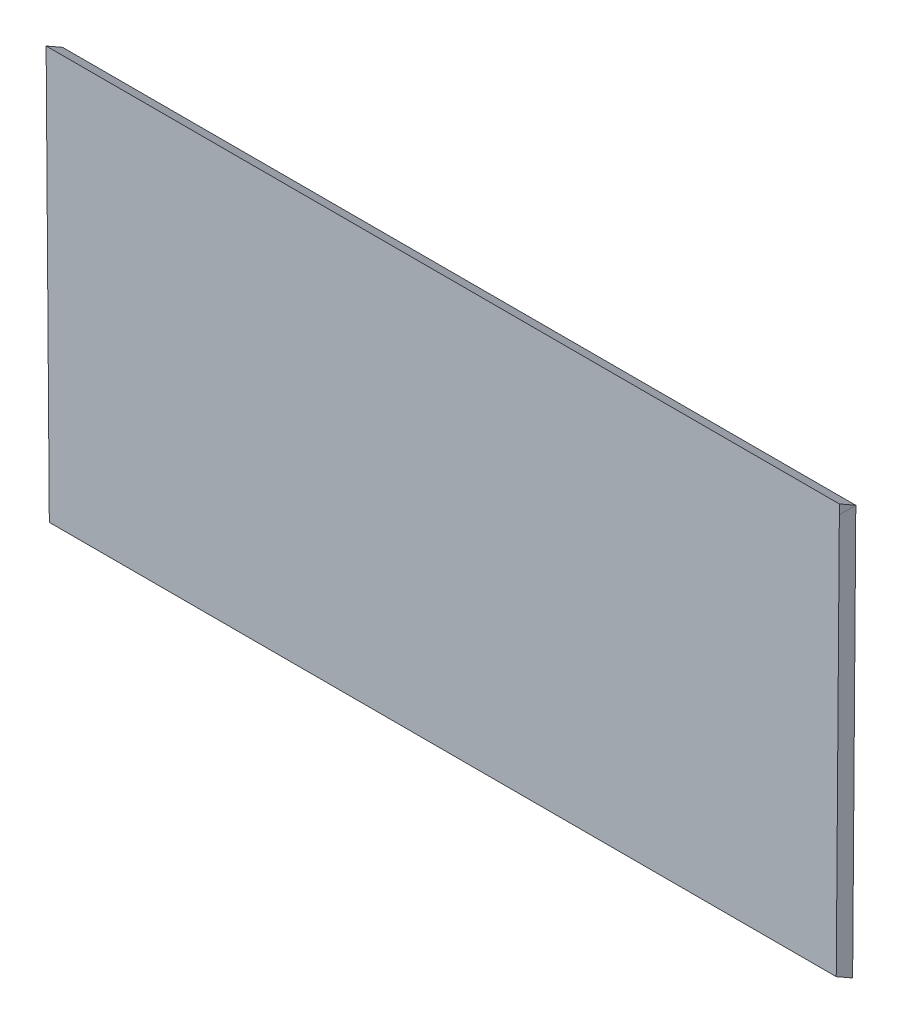
ISO-10303-21;
HEADER;
FILE_DESCRIPTION(('STEP AP214'),'2;1');
FILE_NAME('part.step','',(''),(''),'','','');
FILE_SCHEMA(('AUTOMOTIVE_DESIGN { 1 0 10303 214 1 1 1 1 }'));
ENDSEC;
DATA;
#1=APPLICATION_CONTEXT('core data for automotive mechanical design processes');
#2=APPLICATION_PROTOCOL_DEFINITION('international standard','automotive_design',2000,#1);
#3=PRODUCT_CONTEXT('',#1,'mechanical');
#4=PRODUCT('Part','Part','',(#3));
#5=PRODUCT_RELATED_PRODUCT_CATEGORY('part','',(#4));
#6=PRODUCT_DEFINITION_FORMATION('','',#4);
#7=PRODUCT_DEFINITION_CONTEXT('part definition',#1,'design');
#8=PRODUCT_DEFINITION('design','',#6,#7);
#9=PRODUCT_DEFINITION_SHAPE('','',#8);
#10=(LENGTH_UNIT() NAMED_UNIT(*) SI_UNIT(.MILLI.,.METRE.));
#11=(NAMED_UNIT(*) PLANE_ANGLE_UNIT() SI_UNIT($,.RADIAN.));
#12=(NAMED_UNIT(*) SI_UNIT($,.STERADIAN.) SOLID_ANGLE_UNIT());
#13=UNCERTAINTY_MEASURE_WITH_UNIT(LENGTH_MEASURE(1.E-05),#10,'distance_accuracy_value','');
#14=(GEOMETRIC_REPRESENTATION_CONTEXT(3) GLOBAL_UNCERTAINTY_ASSIGNED_CONTEXT((#13)) GLOBAL_UNIT_ASSIGNED_CONTEXT((#10,
#11,#12)) REPRESENTATION_CONTEXT('',''));
#15=CARTESIAN_POINT('',(0.,0.,0.));
#16=DIRECTION('',(0.,0.,1.));
#17=DIRECTION('',(1.,0.,0.));
#18=AXIS2_PLACEMENT_3D('',#15,#16,#17);
#19=CARTESIAN_POINT('',(-627.102450024694,177.628398295267,30.));
#20=DIRECTION('',(0.999969839219337,0.00776663708782409,0.));
#21=DIRECTION('',(-0.00776663708782409,0.999969839219337,0.));
#22=AXIS2_PLACEMENT_3D('',#19,#20,#21);
#23=PLANE('',#22);
#24=DIRECTION('',(0.00385284417816157,-0.496061284930305,-0.868278962767746));
#25=VECTOR('',#24,1.);
#26=CARTESIAN_POINT('',(-622.819156151908,-373.854133573587,345.089559888972));
#27=LINE('',#26,#25);
#28=CARTESIAN_POINT('',(-621.4209983841,-553.869703049566,30.));
#29=VERTEX_POINT('',#28);
#30=CARTESIAN_POINT('',(-621.287879502524,-571.009021534682,0.000259788680210009));
#31=VERTEX_POINT('',#30);
#32=EDGE_CURVE('E259',#29,#31,#27,.T.);
#33=ORIENTED_EDGE('',*,*,#32,.F.);
#34=DIRECTION('',(0.00776663708782409,-0.999969839219337,0.));
#35=VECTOR('',#34,1.);
#36=CARTESIAN_POINT('',(-627.102450024694,177.628398295267,30.));
#37=LINE('',#36,#35);
#38=CARTESIAN_POINT('',(-627.101225012347,177.628398295267,30.));
#39=VERTEX_POINT('',#38);
#40=EDGE_CURVE('E105',#39,#29,#37,.T.);
#41=ORIENTED_EDGE('',*,*,#40,.F.);
#42=CARTESIAN_POINT('',(-627.102450024694,177.628398295267,30.));
#43=DIRECTION('',(0.,0.,-1.));
#44=VECTOR('',#43,1.);
#45=LINE('',#42,#44);
#46=CARTESIAN_POINT('',(-627.101225012347,177.628398295267,0.));
#47=VERTEX_POINT('',#46);
#48=EDGE_CURVE('E11',#39,#47,#45,.T.);
#49=ORIENTED_EDGE('',*,*,#48,.T.);
#50=DIRECTION('',(0.00776663708782409,-0.999969839219337,0.));
#51=VECTOR('',#50,1.);
#52=CARTESIAN_POINT('',(-627.102450024694,177.628398295267,0.));
#53=LINE('',#52,#51);
#54=CARTESIAN_POINT('',(-621.287879502524,-571.009021534682,0.));
#55=VERTEX_POINT('',#54);
#56=EDGE_CURVE('E89',#47,#55,#53,.T.);
#57=ORIENTED_EDGE('',*,*,#56,.T.);
#58=DIRECTION('',(0.,0.,-1.));
#59=VECTOR('',#58,1.);
#60=CARTESIAN_POINT('',(-621.287879502524,-571.009021534682,30.));
#61=LINE('',#60,#59);
#62=EDGE_CURVE('E47',#31,#55,#61,.T.);
#63=ORIENTED_EDGE('',*,*,#62,.F.);
#64=EDGE_LOOP('',(#33,#41,#49,#57,#63));
#65=FACE_BOUND('',#64,.T.);
#66=ADVANCED_FACE('F39',(#65),#23,.F.);
#67=CARTESIAN_POINT('',(-621.287879502524,-571.009021534682,30.));
#68=DIRECTION('',(1.03560111525525E-07,0.999999999999995,0.));
#69=DIRECTION('',(-0.999999999999995,1.03560111525525E-07,0.));
#70=AXIS2_PLACEMENT_3D('',#67,#68,#69);
#71=PLANE('',#70);
#72=DIRECTION('',(0.999999999999978,-1.03560111525524E-07,-1.81266043029597E-07));
#73=VECTOR('',#72,1.);
#74=CARTESIAN_POINT('',(-621.287884940458,-571.009021534681,0.000259788681195722));
#75=LINE('',#74,#73);
#76=CARTESIAN_POINT('',(811.902120497476,-571.009169955998,0.));
#77=VERTEX_POINT('',#76);
#78=EDGE_CURVE('E83',#31,#77,#75,.T.);
#79=ORIENTED_EDGE('',*,*,#78,.F.);
#80=ORIENTED_EDGE('',*,*,#62,.T.);
#81=DIRECTION('',(0.999999999999994,-1.03560111525525E-07,0.));
#82=VECTOR('',#81,1.);
#83=CARTESIAN_POINT('',(-621.287879502524,-571.009021534682,0.));
#84=LINE('',#83,#82);
#85=EDGE_CURVE('E85',#55,#77,#84,.T.);
#86=ORIENTED_EDGE('',*,*,#85,.T.);
#87=EDGE_LOOP('',(#79,#80,#86));
#88=FACE_BOUND('',#87,.T.);
#89=ADVANCED_FACE('F78',(#88),#71,.F.);
#90=CARTESIAN_POINT('',(811.902120497476,-571.009169955998,30.));
#91=DIRECTION('',(-0.999970037468631,0.00774107001553363,0.));
#92=DIRECTION('',(-0.00774107001553363,-0.999970037468631,0.));
#93=AXIS2_PLACEMENT_3D('',#90,#91,#92);
#94=PLANE('',#93);
#95=DIRECTION('',(0.00384016038691892,0.496061309132617,0.86827900513017));
#96=VECTOR('',#95,1.);
#97=CARTESIAN_POINT('',(812.002150416685,-558.087581356681,22.6172529224951));
#98=LINE('',#97,#96);
#99=CARTESIAN_POINT('',(812.03480228631,-553.869703049566,30.));
#100=VERTEX_POINT('',#99);
#101=EDGE_CURVE('E57',#77,#100,#98,.T.);
#102=ORIENTED_EDGE('',*,*,#101,.F.);
#103=DIRECTION('',(0.00774107001553363,0.999970037468631,0.));
#104=VECTOR('',#103,1.);
#105=CARTESIAN_POINT('',(811.902120497476,-571.009169955998,0.));
#106=LINE('',#105,#104);
#107=CARTESIAN_POINT('',(817.698774987653,177.628398295267,0.));
#108=VERTEX_POINT('',#107);
#109=EDGE_CURVE('E99',#77,#108,#106,.T.);
#110=ORIENTED_EDGE('',*,*,#109,.T.);
#111=CARTESIAN_POINT('',(817.7,177.628398295267,30.));
#112=DIRECTION('',(0.,0.,-1.));
#113=VECTOR('',#112,1.);
#114=LINE('',#111,#113);
#115=CARTESIAN_POINT('',(817.698774987653,177.628398295267,30.));
#116=VERTEX_POINT('',#115);
#117=EDGE_CURVE('E86',#116,#108,#114,.T.);
#118=ORIENTED_EDGE('',*,*,#117,.F.);
#119=DIRECTION('',(0.00774107001553363,0.999970037468631,0.));
#120=VECTOR('',#119,1.);
#121=CARTESIAN_POINT('',(811.902120497476,-571.009169955998,30.));
#122=LINE('',#121,#120);
#123=EDGE_CURVE('E43',#100,#116,#122,.T.);
#124=ORIENTED_EDGE('',*,*,#123,.F.);
#125=EDGE_LOOP('',(#102,#110,#118,#124));
#126=FACE_BOUND('',#125,.T.);
#127=ADVANCED_FACE('F133',(#126),#94,.F.);
#128=CARTESIAN_POINT('',(0.,0.,30.));
#129=DIRECTION('',(0.,0.,-1.));
#130=DIRECTION('',(-1.,0.,0.));
#131=AXIS2_PLACEMENT_3D('',#128,#129,#130);
#132=PLANE('',#131);
#133=DIRECTION('',(-1.,0.,0.));
#134=VECTOR('',#133,1.);
#135=CARTESIAN_POINT('',(817.7,-553.869703049566,30.));
#136=LINE('',#135,#134);
#137=EDGE_CURVE('E274',#100,#29,#136,.T.);
#138=ORIENTED_EDGE('',*,*,#137,.F.);
#139=ORIENTED_EDGE('',*,*,#123,.T.);
#140=DIRECTION('',(0.,-1.,0.));
#141=VECTOR('',#140,1.);
#142=CARTESIAN_POINT('',(817.7,177.628398295267,30.));
#143=LINE('',#142,#141);
#144=CARTESIAN_POINT('',(817.7,194.767865201699,30.));
#145=VERTEX_POINT('',#144);
#146=EDGE_CURVE('E244',#145,#116,#143,.T.);
#147=ORIENTED_EDGE('',*,*,#146,.F.);
#148=DIRECTION('',(1.,0.,0.));
#149=VECTOR('',#148,1.);
#150=CARTESIAN_POINT('',(-627.1,194.767865201699,30.));
#151=LINE('',#150,#149);
#152=CARTESIAN_POINT('',(-627.1,194.767865201699,30.));
#153=VERTEX_POINT('',#152);
#154=EDGE_CURVE('E124',#153,#145,#151,.T.);
#155=ORIENTED_EDGE('',*,*,#154,.F.);
#156=DIRECTION('',(0.,-1.,0.));
#157=VECTOR('',#156,1.);
#158=CARTESIAN_POINT('',(-627.1,177.628398295267,30.));
#159=LINE('',#158,#157);
#160=EDGE_CURVE('E230',#153,#39,#159,.T.);
#161=ORIENTED_EDGE('',*,*,#160,.T.);
#162=ORIENTED_EDGE('',*,*,#40,.T.);
#163=EDGE_LOOP('',(#138,#139,#147,#155,#161,#162));
#164=FACE_BOUND('',#163,.T.);
#165=ADVANCED_FACE('F141',(#164),#132,.F.);
#166=CARTESIAN_POINT('',(0.,0.,0.));
#167=DIRECTION('',(0.,0.,-1.));
#168=DIRECTION('',(-1.,0.,0.));
#169=AXIS2_PLACEMENT_3D('',#166,#167,#168);
#170=PLANE('',#169);
#171=DIRECTION('',(-1.,0.,0.));
#172=VECTOR('',#171,1.);
#173=CARTESIAN_POINT('',(817.697549975305,177.628398295267,0.));
#174=LINE('',#173,#172);
#175=EDGE_CURVE('E96',#108,#47,#174,.T.);
#176=ORIENTED_EDGE('',*,*,#175,.F.);
#177=ORIENTED_EDGE('',*,*,#109,.F.);
#178=ORIENTED_EDGE('',*,*,#85,.F.);
#179=ORIENTED_EDGE('',*,*,#56,.F.);
#180=EDGE_LOOP('',(#176,#177,#178,#179));
#181=FACE_BOUND('',#180,.T.);
#182=ADVANCED_FACE('F98',(#181),#170,.T.);
#183=CARTESIAN_POINT('',(-627.1,194.767865201699,30.));
#184=DIRECTION('',(0.,0.868285407383201,-0.496064966839415));
#185=DIRECTION('',(0.,0.496064966839415,0.868285407383201));
#186=AXIS2_PLACEMENT_3D('',#183,#184,#185);
#187=PLANE('',#186);
#188=ORIENTED_EDGE('',*,*,#154,.T.);
#189=DIRECTION('',(0.,0.496064966839415,0.8682854073832));
#190=VECTOR('',#189,1.);
#191=CARTESIAN_POINT('',(817.7,194.767865201699,30.));
#192=LINE('',#191,#190);
#193=EDGE_CURVE('E260',#108,#145,#192,.T.);
#194=ORIENTED_EDGE('',*,*,#193,.F.);
#195=ORIENTED_EDGE('',*,*,#175,.T.);
#196=DIRECTION('',(0.,0.496064966839415,0.8682854073832));
#197=VECTOR('',#196,1.);
#198=CARTESIAN_POINT('',(-627.1,194.767865201699,30.));
#199=LINE('',#198,#197);
#200=EDGE_CURVE('E237',#47,#153,#199,.T.);
#201=ORIENTED_EDGE('',*,*,#200,.T.);
#202=EDGE_LOOP('',(#188,#194,#195,#201));
#203=FACE_BOUND('',#202,.T.);
#204=ADVANCED_FACE('F168',(#203),#187,.T.);
#205=CARTESIAN_POINT('',(-627.1,0.,0.));
#206=DIRECTION('',(1.,0.,0.));
#207=DIRECTION('',(0.,0.,-1.));
#208=AXIS2_PLACEMENT_3D('',#205,#206,#207);
#209=PLANE('',#208);
#210=ORIENTED_EDGE('',*,*,#200,.F.);
#211=ORIENTED_EDGE('',*,*,#48,.F.);
#212=ORIENTED_EDGE('',*,*,#160,.F.);
#213=EDGE_LOOP('',(#210,#211,#212));
#214=FACE_BOUND('',#213,.T.);
#215=ADVANCED_FACE('F159',(#214),#209,.F.);
#216=CARTESIAN_POINT('',(817.7,0.,0.));
#217=DIRECTION('',(1.,0.,0.));
#218=DIRECTION('',(0.,0.,-1.));
#219=AXIS2_PLACEMENT_3D('',#216,#217,#218);
#220=PLANE('',#219);
#221=ORIENTED_EDGE('',*,*,#193,.T.);
#222=ORIENTED_EDGE('',*,*,#146,.T.);
#223=ORIENTED_EDGE('',*,*,#117,.T.);
#224=EDGE_LOOP('',(#221,#222,#223));
#225=FACE_BOUND('',#224,.T.);
#226=ADVANCED_FACE('F154',(#225),#220,.T.);
#227=CARTESIAN_POINT('',(817.7,-553.869703049566,30.));
#228=DIRECTION('',(0.,-0.8682854073832,0.496064966839415));
#229=DIRECTION('',(0.,-0.496064966839415,-0.8682854073832));
#230=AXIS2_PLACEMENT_3D('',#227,#228,#229);
#231=PLANE('',#230);
#232=ORIENTED_EDGE('',*,*,#32,.T.);
#233=ORIENTED_EDGE('',*,*,#78,.T.);
#234=ORIENTED_EDGE('',*,*,#101,.T.);
#235=ORIENTED_EDGE('',*,*,#137,.T.);
#236=EDGE_LOOP('',(#232,#233,#234,#235));
#237=FACE_BOUND('',#236,.T.);
#238=ADVANCED_FACE('F157',(#237),#231,.T.);
#239=CLOSED_SHELL('',(#66,#89,#127,#165,#182,#204,#215,#226,#238));
#240=MANIFOLD_SOLID_BREP('B2',#239);
#241=ADVANCED_BREP_SHAPE_REPRESENTATION('',(#18,#240),#14);
#242=SHAPE_DEFINITION_REPRESENTATION(#9,#241);
ENDSEC;
END-ISO-10303-21;
